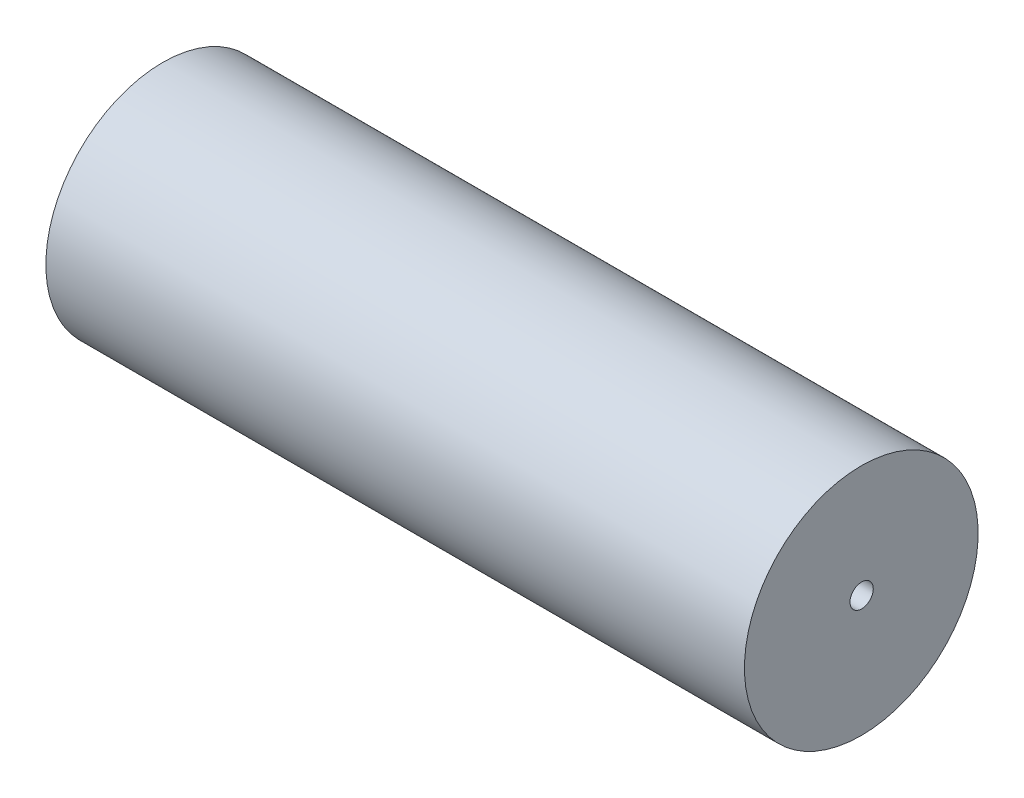
ISO-10303-21;
HEADER;
FILE_DESCRIPTION(('STEP AP214'),'2;1');
FILE_NAME('part.step','',(''),(''),'','','');
FILE_SCHEMA(('AUTOMOTIVE_DESIGN { 1 0 10303 214 1 1 1 1 }'));
ENDSEC;
DATA;
#1=APPLICATION_CONTEXT('core data for automotive mechanical design processes');
#2=APPLICATION_PROTOCOL_DEFINITION('international standard','automotive_design',2000,#1);
#3=PRODUCT_CONTEXT('',#1,'mechanical');
#4=PRODUCT('Part','Part','',(#3));
#5=PRODUCT_RELATED_PRODUCT_CATEGORY('part','',(#4));
#6=PRODUCT_DEFINITION_FORMATION('','',#4);
#7=PRODUCT_DEFINITION_CONTEXT('part definition',#1,'design');
#8=PRODUCT_DEFINITION('design','',#6,#7);
#9=PRODUCT_DEFINITION_SHAPE('','',#8);
#10=(LENGTH_UNIT() NAMED_UNIT(*) SI_UNIT(.MILLI.,.METRE.));
#11=(NAMED_UNIT(*) PLANE_ANGLE_UNIT() SI_UNIT($,.RADIAN.));
#12=(NAMED_UNIT(*) SI_UNIT($,.STERADIAN.) SOLID_ANGLE_UNIT());
#13=UNCERTAINTY_MEASURE_WITH_UNIT(LENGTH_MEASURE(1.E-05),#10,'distance_accuracy_value','');
#14=(GEOMETRIC_REPRESENTATION_CONTEXT(3) GLOBAL_UNCERTAINTY_ASSIGNED_CONTEXT((#13)) GLOBAL_UNIT_ASSIGNED_CONTEXT((#10,
#11,#12)) REPRESENTATION_CONTEXT('',''));
#15=CARTESIAN_POINT('',(0.,0.,0.));
#16=DIRECTION('',(0.,0.,1.));
#17=DIRECTION('',(1.,0.,0.));
#18=AXIS2_PLACEMENT_3D('',#15,#16,#17);
#19=CARTESIAN_POINT('',(-35.0857882247291,10.1477047699325,0.));
#20=DIRECTION('',(-1.,0.,0.));
#21=DIRECTION('',(0.,-1.,0.));
#22=AXIS2_PLACEMENT_3D('',#19,#20,#21);
#23=PLANE('',#22);
#24=CARTESIAN_POINT('',(-35.0857882247291,10.5231003613888,-0.0288584991931032));
#25=DIRECTION('',(1.,0.,0.));
#26=DIRECTION('',(0.,1.,0.));
#27=AXIS2_PLACEMENT_3D('',#24,#25,#26);
#28=CIRCLE('',#27,1.);
#29=CARTESIAN_POINT('',(-35.0857882247291,11.5231003613888,-0.0288584991931032));
#30=VERTEX_POINT('',#29);
#31=EDGE_CURVE('E56',#30,#30,#28,.T.);
#32=ORIENTED_EDGE('',*,*,#31,.T.);
#33=EDGE_LOOP('',(#32));
#34=FACE_BOUND('',#33,.T.);
#35=CARTESIAN_POINT('',(-35.0857882247291,10.1477047699325,0.));
#36=DIRECTION('',(-1.,0.,0.));
#37=DIRECTION('',(0.,-1.,0.));
#38=AXIS2_PLACEMENT_3D('',#35,#36,#37);
#39=CIRCLE('',#38,10.0358538581967);
#40=CARTESIAN_POINT('',(-35.0857882247291,0.111850911735819,0.));
#41=VERTEX_POINT('',#40);
#42=EDGE_CURVE('E10',#41,#41,#39,.T.);
#43=ORIENTED_EDGE('',*,*,#42,.T.);
#44=EDGE_LOOP('',(#43));
#45=FACE_BOUND('',#44,.T.);
#46=ADVANCED_FACE('F41',(#34,#45),#23,.T.);
#47=CARTESIAN_POINT('',(-35.0857882247291,10.1477047699325,0.));
#48=DIRECTION('',(-1.,0.,0.));
#49=DIRECTION('',(0.,-1.,0.));
#50=AXIS2_PLACEMENT_3D('',#47,#48,#49);
#51=CYLINDRICAL_SURFACE('',#50,10.0358538581967);
#52=CARTESIAN_POINT('',(24.9142117752709,10.1477047699325,0.));
#53=DIRECTION('',(-1.,0.,0.));
#54=DIRECTION('',(0.,-1.,0.));
#55=AXIS2_PLACEMENT_3D('',#52,#53,#54);
#56=CIRCLE('',#55,10.0358538581967);
#57=CARTESIAN_POINT('',(24.914211775271,0.111850911735829,0.));
#58=VERTEX_POINT('',#57);
#59=EDGE_CURVE('E49',#58,#58,#56,.T.);
#60=ORIENTED_EDGE('',*,*,#59,.T.);
#61=EDGE_LOOP('',(#60));
#62=FACE_BOUND('',#61,.T.);
#63=ORIENTED_EDGE('',*,*,#42,.F.);
#64=EDGE_LOOP('',(#63));
#65=FACE_BOUND('',#64,.T.);
#66=ADVANCED_FACE('F71',(#62,#65),#51,.T.);
#67=CARTESIAN_POINT('',(24.9142117752709,0.11185091173583,0.));
#68=DIRECTION('',(1.,0.,0.));
#69=DIRECTION('',(0.,1.,0.));
#70=AXIS2_PLACEMENT_3D('',#67,#68,#69);
#71=PLANE('',#70);
#72=CARTESIAN_POINT('',(24.9142117752709,10.5231003613888,-0.0288584991931032));
#73=DIRECTION('',(1.,0.,0.));
#74=DIRECTION('',(0.,1.,0.));
#75=AXIS2_PLACEMENT_3D('',#72,#73,#74);
#76=CIRCLE('',#75,1.);
#77=CARTESIAN_POINT('',(24.9142117752709,11.5231003613888,-0.0288584991931032));
#78=VERTEX_POINT('',#77);
#79=EDGE_CURVE('E44',#78,#78,#76,.T.);
#80=ORIENTED_EDGE('',*,*,#79,.F.);
#81=EDGE_LOOP('',(#80));
#82=FACE_BOUND('',#81,.T.);
#83=ORIENTED_EDGE('',*,*,#59,.F.);
#84=EDGE_LOOP('',(#83));
#85=FACE_BOUND('',#84,.T.);
#86=ADVANCED_FACE('F68',(#82,#85),#71,.T.);
#87=CARTESIAN_POINT('',(-35.0857882247291,10.5231003613888,-0.0288584991931032));
#88=DIRECTION('',(1.,0.,0.));
#89=DIRECTION('',(0.,1.,0.));
#90=AXIS2_PLACEMENT_3D('',#87,#88,#89);
#91=CYLINDRICAL_SURFACE('',#90,1.);
#92=ORIENTED_EDGE('',*,*,#79,.T.);
#93=EDGE_LOOP('',(#92));
#94=FACE_BOUND('',#93,.T.);
#95=ORIENTED_EDGE('',*,*,#31,.F.);
#96=EDGE_LOOP('',(#95));
#97=FACE_BOUND('',#96,.T.);
#98=ADVANCED_FACE('F65',(#94,#97),#91,.F.);
#99=CLOSED_SHELL('',(#46,#66,#86,#98));
#100=MANIFOLD_SOLID_BREP('B2',#99);
#101=ADVANCED_BREP_SHAPE_REPRESENTATION('',(#18,#100),#14);
#102=SHAPE_DEFINITION_REPRESENTATION(#9,#101);
ENDSEC;
END-ISO-10303-21;
